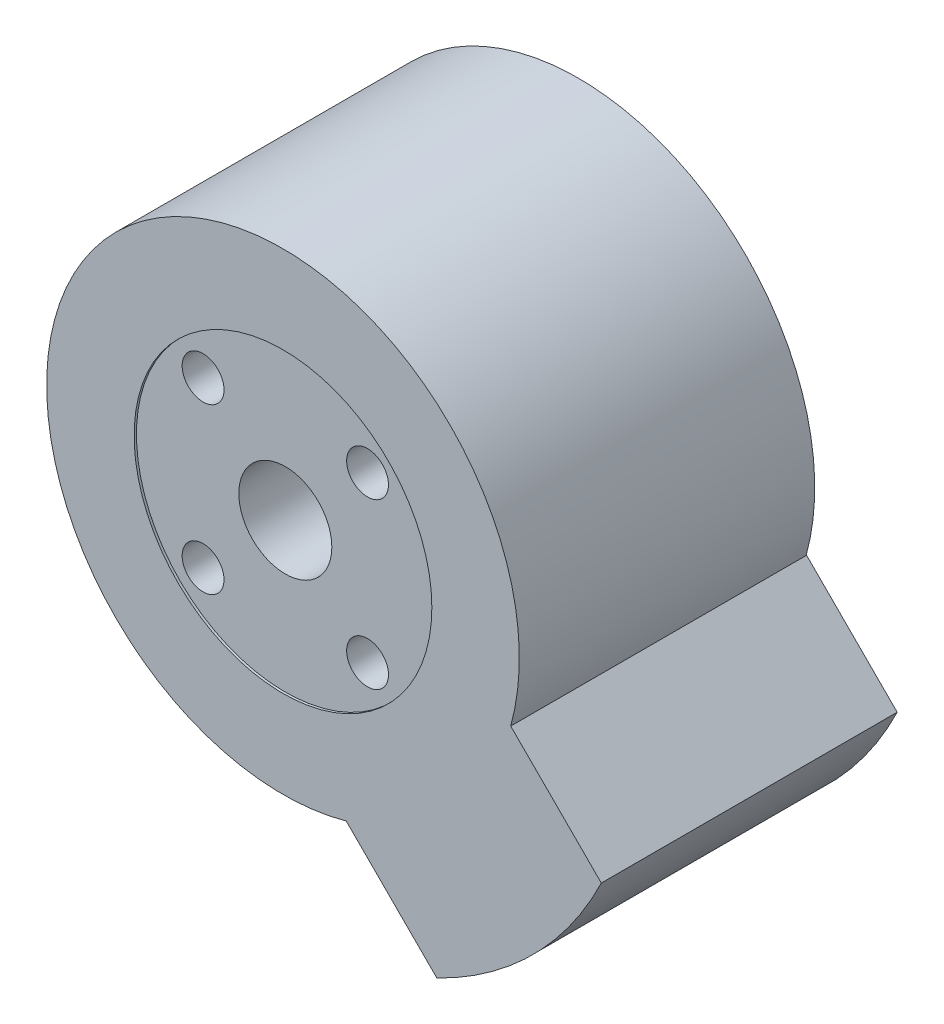
ISO-10303-21;
HEADER;
FILE_DESCRIPTION(('STEP AP214'),'2;1');
FILE_NAME('part.step','',(''),(''),'','','');
FILE_SCHEMA(('AUTOMOTIVE_DESIGN { 1 0 10303 214 1 1 1 1 }'));
ENDSEC;
DATA;
#1=APPLICATION_CONTEXT('core data for automotive mechanical design processes');
#2=APPLICATION_PROTOCOL_DEFINITION('international standard','automotive_design',2000,#1);
#3=PRODUCT_CONTEXT('',#1,'mechanical');
#4=PRODUCT('Part','Part','',(#3));
#5=PRODUCT_RELATED_PRODUCT_CATEGORY('part','',(#4));
#6=PRODUCT_DEFINITION_FORMATION('','',#4);
#7=PRODUCT_DEFINITION_CONTEXT('part definition',#1,'design');
#8=PRODUCT_DEFINITION('design','',#6,#7);
#9=PRODUCT_DEFINITION_SHAPE('','',#8);
#10=(LENGTH_UNIT() NAMED_UNIT(*) SI_UNIT(.MILLI.,.METRE.));
#11=(NAMED_UNIT(*) PLANE_ANGLE_UNIT() SI_UNIT($,.RADIAN.));
#12=(NAMED_UNIT(*) SI_UNIT($,.STERADIAN.) SOLID_ANGLE_UNIT());
#13=UNCERTAINTY_MEASURE_WITH_UNIT(LENGTH_MEASURE(1.E-05),#10,'distance_accuracy_value','');
#14=(GEOMETRIC_REPRESENTATION_CONTEXT(3) GLOBAL_UNCERTAINTY_ASSIGNED_CONTEXT((#13)) GLOBAL_UNIT_ASSIGNED_CONTEXT((#10,
#11,#12)) REPRESENTATION_CONTEXT('',''));
#15=CARTESIAN_POINT('',(0.,0.,0.));
#16=DIRECTION('',(0.,0.,1.));
#17=DIRECTION('',(1.,0.,0.));
#18=AXIS2_PLACEMENT_3D('',#15,#16,#17);
#19=CARTESIAN_POINT('',(0.,0.,-31.75));
#20=DIRECTION('',(0.,0.,1.));
#21=DIRECTION('',(1.,0.,0.));
#22=AXIS2_PLACEMENT_3D('',#19,#20,#21);
#23=CYLINDRICAL_SURFACE('',#22,25.4);
#24=DIRECTION('',(0.,0.,1.));
#25=VECTOR('',#24,1.);
#26=CARTESIAN_POINT('',(24.4738915284,-6.79622199873641,-31.8));
#27=LINE('',#26,#25);
#28=CARTESIAN_POINT('',(24.4738915284,-6.79622199873641,-31.75));
#29=VERTEX_POINT('',#28);
#30=CARTESIAN_POINT('',(24.4738915284,-6.79622199873641,0.));
#31=VERTEX_POINT('',#30);
#32=EDGE_CURVE('E114',#29,#31,#27,.T.);
#33=ORIENTED_EDGE('',*,*,#32,.F.);
#34=CARTESIAN_POINT('',(0.,0.,-31.75));
#35=DIRECTION('',(0.,0.,1.));
#36=DIRECTION('',(1.,0.,0.));
#37=AXIS2_PLACEMENT_3D('',#34,#35,#36);
#38=CIRCLE('',#37,25.4);
#39=CARTESIAN_POINT('',(6.79622199873634,-24.4738915284001,-31.75));
#40=VERTEX_POINT('',#39);
#41=EDGE_CURVE('E40',#29,#40,#38,.T.);
#42=ORIENTED_EDGE('',*,*,#41,.T.);
#43=DIRECTION('',(0.,0.,1.));
#44=VECTOR('',#43,1.);
#45=CARTESIAN_POINT('',(6.79622199873634,-24.4738915284001,-31.8));
#46=LINE('',#45,#44);
#47=CARTESIAN_POINT('',(6.79622199873634,-24.4738915284001,0.));
#48=VERTEX_POINT('',#47);
#49=EDGE_CURVE('E84',#40,#48,#46,.T.);
#50=ORIENTED_EDGE('',*,*,#49,.T.);
#51=CARTESIAN_POINT('',(0.,0.,0.));
#52=DIRECTION('',(0.,0.,1.));
#53=DIRECTION('',(1.,0.,0.));
#54=AXIS2_PLACEMENT_3D('',#51,#52,#53);
#55=CIRCLE('',#54,25.4);
#56=EDGE_CURVE('E35',#31,#48,#55,.T.);
#57=ORIENTED_EDGE('',*,*,#56,.F.);
#58=EDGE_LOOP('',(#33,#42,#50,#57));
#59=FACE_BOUND('',#58,.T.);
#60=ADVANCED_FACE('F32',(#59),#23,.T.);
#61=CARTESIAN_POINT('',(0.,0.,-31.75));
#62=DIRECTION('',(0.,0.,1.));
#63=DIRECTION('',(1.,0.,0.));
#64=AXIS2_PLACEMENT_3D('',#61,#62,#63);
#65=PLANE('',#64);
#66=CARTESIAN_POINT('',(0.,0.,-31.75));
#67=DIRECTION('',(0.,0.,1.));
#68=DIRECTION('',(1.,0.,0.));
#69=AXIS2_PLACEMENT_3D('',#66,#67,#68);
#70=CIRCLE('',#69,5.);
#71=CARTESIAN_POINT('',(5.,0.,-31.75));
#72=VERTEX_POINT('',#71);
#73=EDGE_CURVE('E118',#72,#72,#70,.T.);
#74=ORIENTED_EDGE('',*,*,#73,.T.);
#75=EDGE_LOOP('',(#74));
#76=FACE_BOUND('',#75,.T.);
#77=CARTESIAN_POINT('',(-8.83883476483185,8.83883476483185,-31.75));
#78=DIRECTION('',(0.,0.,1.));
#79=DIRECTION('',(1.,0.,0.));
#80=AXIS2_PLACEMENT_3D('',#77,#78,#79);
#81=CIRCLE('',#80,2.25);
#82=CARTESIAN_POINT('',(-6.58883476483185,8.83883476483185,-31.75));
#83=VERTEX_POINT('',#82);
#84=EDGE_CURVE('E126',#83,#83,#81,.T.);
#85=ORIENTED_EDGE('',*,*,#84,.T.);
#86=EDGE_LOOP('',(#85));
#87=FACE_BOUND('',#86,.T.);
#88=CARTESIAN_POINT('',(8.83883476483184,8.83883476483185,-31.75));
#89=DIRECTION('',(0.,0.,1.));
#90=DIRECTION('',(1.,0.,0.));
#91=AXIS2_PLACEMENT_3D('',#88,#89,#90);
#92=CIRCLE('',#91,2.25);
#93=CARTESIAN_POINT('',(11.0888347648318,8.83883476483185,-31.75));
#94=VERTEX_POINT('',#93);
#95=EDGE_CURVE('E132',#94,#94,#92,.T.);
#96=ORIENTED_EDGE('',*,*,#95,.T.);
#97=EDGE_LOOP('',(#96));
#98=FACE_BOUND('',#97,.T.);
#99=CARTESIAN_POINT('',(-8.83883476483185,-8.83883476483185,-31.75));
#100=DIRECTION('',(0.,0.,1.));
#101=DIRECTION('',(1.,0.,0.));
#102=AXIS2_PLACEMENT_3D('',#99,#100,#101);
#103=CIRCLE('',#102,2.25);
#104=CARTESIAN_POINT('',(-6.58883476483185,-8.83883476483185,-31.75));
#105=VERTEX_POINT('',#104);
#106=EDGE_CURVE('E138',#105,#105,#103,.T.);
#107=ORIENTED_EDGE('',*,*,#106,.T.);
#108=EDGE_LOOP('',(#107));
#109=FACE_BOUND('',#108,.T.);
#110=CARTESIAN_POINT('',(8.83883476483184,-8.83883476483185,-31.75));
#111=DIRECTION('',(0.,0.,1.));
#112=DIRECTION('',(1.,0.,0.));
#113=AXIS2_PLACEMENT_3D('',#110,#111,#112);
#114=CIRCLE('',#113,2.25);
#115=CARTESIAN_POINT('',(11.0888347648318,-8.83883476483185,-31.75));
#116=VERTEX_POINT('',#115);
#117=EDGE_CURVE('E144',#116,#116,#114,.T.);
#118=ORIENTED_EDGE('',*,*,#117,.T.);
#119=EDGE_LOOP('',(#118));
#120=FACE_BOUND('',#119,.T.);
#121=EDGE_CURVE('E11',#40,#29,#38,.T.);
#122=ORIENTED_EDGE('',*,*,#121,.F.);
#123=ORIENTED_EDGE('',*,*,#41,.F.);
#124=EDGE_LOOP('',(#122,#123));
#125=FACE_BOUND('',#124,.T.);
#126=ADVANCED_FACE('F158',(#76,#87,#98,#109,#120,#125),#65,.F.);
#127=CARTESIAN_POINT('',(0.,0.,0.));
#128=DIRECTION('',(0.,0.,1.));
#129=DIRECTION('',(1.,0.,0.));
#130=AXIS2_PLACEMENT_3D('',#127,#128,#129);
#131=PLANE('',#130);
#132=CARTESIAN_POINT('',(0.,0.,0.));
#133=DIRECTION('',(0.,0.,1.));
#134=DIRECTION('',(1.,0.,0.));
#135=AXIS2_PLACEMENT_3D('',#132,#133,#134);
#136=CIRCLE('',#135,16.);
#137=CARTESIAN_POINT('',(16.,0.,0.));
#138=VERTEX_POINT('',#137);
#139=EDGE_CURVE('E147',#138,#138,#136,.T.);
#140=ORIENTED_EDGE('',*,*,#139,.F.);
#141=EDGE_LOOP('',(#140));
#142=FACE_BOUND('',#141,.T.);
#143=ORIENTED_EDGE('',*,*,#56,.T.);
#144=DIRECTION('',(0.707106781186546,-0.707106781186549,0.));
#145=VECTOR('',#144,1.);
#146=CARTESIAN_POINT('',(6.79622199873634,-24.4738915284001,0.));
#147=LINE('',#146,#145);
#148=CARTESIAN_POINT('',(16.5358573515269,-34.2135268811906,0.));
#149=VERTEX_POINT('',#148);
#150=EDGE_CURVE('E108',#48,#149,#147,.T.);
#151=ORIENTED_EDGE('',*,*,#150,.T.);
#152=CARTESIAN_POINT('',(0.,0.,0.));
#153=DIRECTION('',(0.,0.,1.));
#154=DIRECTION('',(1.,0.,0.));
#155=AXIS2_PLACEMENT_3D('',#152,#153,#154);
#156=CIRCLE('',#155,38.);
#157=CARTESIAN_POINT('',(34.2135268811906,-16.535857351527,0.));
#158=VERTEX_POINT('',#157);
#159=EDGE_CURVE('E102',#149,#158,#156,.T.);
#160=ORIENTED_EDGE('',*,*,#159,.T.);
#161=DIRECTION('',(-0.707106781186547,0.707106781186548,0.));
#162=VECTOR('',#161,1.);
#163=CARTESIAN_POINT('',(24.4738915284,-6.79622199873641,0.));
#164=LINE('',#163,#162);
#165=EDGE_CURVE('E47',#158,#31,#164,.T.);
#166=ORIENTED_EDGE('',*,*,#165,.T.);
#167=EDGE_LOOP('',(#143,#151,#160,#166));
#168=FACE_BOUND('',#167,.T.);
#169=ADVANCED_FACE('F156',(#142,#168),#131,.T.);
#170=CARTESIAN_POINT('',(0.,0.,-0.25));
#171=DIRECTION('',(0.,0.,1.));
#172=DIRECTION('',(1.,0.,0.));
#173=AXIS2_PLACEMENT_3D('',#170,#171,#172);
#174=CYLINDRICAL_SURFACE('',#173,16.);
#175=CARTESIAN_POINT('',(0.,0.,-0.25));
#176=DIRECTION('',(0.,0.,1.));
#177=DIRECTION('',(1.,0.,0.));
#178=AXIS2_PLACEMENT_3D('',#175,#176,#177);
#179=CIRCLE('',#178,16.);
#180=CARTESIAN_POINT('',(16.,0.,-0.25));
#181=VERTEX_POINT('',#180);
#182=EDGE_CURVE('E148',#181,#181,#179,.T.);
#183=ORIENTED_EDGE('',*,*,#182,.F.);
#184=EDGE_LOOP('',(#183));
#185=FACE_BOUND('',#184,.T.);
#186=ORIENTED_EDGE('',*,*,#139,.T.);
#187=EDGE_LOOP('',(#186));
#188=FACE_BOUND('',#187,.T.);
#189=ADVANCED_FACE('F154',(#185,#188),#174,.F.);
#190=CARTESIAN_POINT('',(0.,0.,-0.25));
#191=DIRECTION('',(0.,0.,1.));
#192=DIRECTION('',(1.,0.,0.));
#193=AXIS2_PLACEMENT_3D('',#190,#191,#192);
#194=PLANE('',#193);
#195=CARTESIAN_POINT('',(0.,0.,-0.25));
#196=DIRECTION('',(0.,0.,1.));
#197=DIRECTION('',(1.,0.,0.));
#198=AXIS2_PLACEMENT_3D('',#195,#196,#197);
#199=CIRCLE('',#198,5.);
#200=CARTESIAN_POINT('',(5.,0.,-0.25));
#201=VERTEX_POINT('',#200);
#202=EDGE_CURVE('E113',#201,#201,#199,.T.);
#203=ORIENTED_EDGE('',*,*,#202,.F.);
#204=EDGE_LOOP('',(#203));
#205=FACE_BOUND('',#204,.T.);
#206=CARTESIAN_POINT('',(-8.83883476483185,8.83883476483185,-0.25));
#207=DIRECTION('',(0.,0.,1.));
#208=DIRECTION('',(1.,0.,0.));
#209=AXIS2_PLACEMENT_3D('',#206,#207,#208);
#210=CIRCLE('',#209,2.25);
#211=CARTESIAN_POINT('',(-6.58883476483185,8.83883476483185,-0.25));
#212=VERTEX_POINT('',#211);
#213=EDGE_CURVE('E121',#212,#212,#210,.T.);
#214=ORIENTED_EDGE('',*,*,#213,.F.);
#215=EDGE_LOOP('',(#214));
#216=FACE_BOUND('',#215,.T.);
#217=CARTESIAN_POINT('',(8.83883476483184,8.83883476483185,-0.25));
#218=DIRECTION('',(0.,0.,1.));
#219=DIRECTION('',(1.,0.,0.));
#220=AXIS2_PLACEMENT_3D('',#217,#218,#219);
#221=CIRCLE('',#220,2.25);
#222=CARTESIAN_POINT('',(11.0888347648318,8.83883476483185,-0.25));
#223=VERTEX_POINT('',#222);
#224=EDGE_CURVE('E129',#223,#223,#221,.T.);
#225=ORIENTED_EDGE('',*,*,#224,.F.);
#226=EDGE_LOOP('',(#225));
#227=FACE_BOUND('',#226,.T.);
#228=CARTESIAN_POINT('',(-8.83883476483185,-8.83883476483185,-0.25));
#229=DIRECTION('',(0.,0.,1.));
#230=DIRECTION('',(1.,0.,0.));
#231=AXIS2_PLACEMENT_3D('',#228,#229,#230);
#232=CIRCLE('',#231,2.25);
#233=CARTESIAN_POINT('',(-6.58883476483185,-8.83883476483185,-0.25));
#234=VERTEX_POINT('',#233);
#235=EDGE_CURVE('E135',#234,#234,#232,.T.);
#236=ORIENTED_EDGE('',*,*,#235,.F.);
#237=EDGE_LOOP('',(#236));
#238=FACE_BOUND('',#237,.T.);
#239=CARTESIAN_POINT('',(8.83883476483184,-8.83883476483185,-0.25));
#240=DIRECTION('',(0.,0.,1.));
#241=DIRECTION('',(1.,0.,0.));
#242=AXIS2_PLACEMENT_3D('',#239,#240,#241);
#243=CIRCLE('',#242,2.25);
#244=CARTESIAN_POINT('',(11.0888347648318,-8.83883476483185,-0.25));
#245=VERTEX_POINT('',#244);
#246=EDGE_CURVE('E141',#245,#245,#243,.T.);
#247=ORIENTED_EDGE('',*,*,#246,.F.);
#248=EDGE_LOOP('',(#247));
#249=FACE_BOUND('',#248,.T.);
#250=ORIENTED_EDGE('',*,*,#182,.T.);
#251=EDGE_LOOP('',(#250));
#252=FACE_BOUND('',#251,.T.);
#253=ADVANCED_FACE('F174',(#205,#216,#227,#238,#249,#252),#194,.T.);
#254=CARTESIAN_POINT('',(8.83883476483184,-8.83883476483185,-0.25));
#255=DIRECTION('',(0.,0.,1.));
#256=DIRECTION('',(1.,0.,0.));
#257=AXIS2_PLACEMENT_3D('',#254,#255,#256);
#258=CYLINDRICAL_SURFACE('',#257,2.25);
#259=ORIENTED_EDGE('',*,*,#117,.F.);
#260=EDGE_LOOP('',(#259));
#261=FACE_BOUND('',#260,.T.);
#262=ORIENTED_EDGE('',*,*,#246,.T.);
#263=EDGE_LOOP('',(#262));
#264=FACE_BOUND('',#263,.T.);
#265=ADVANCED_FACE('F178',(#261,#264),#258,.F.);
#266=CARTESIAN_POINT('',(-8.83883476483185,-8.83883476483185,-0.25));
#267=DIRECTION('',(0.,0.,1.));
#268=DIRECTION('',(1.,0.,0.));
#269=AXIS2_PLACEMENT_3D('',#266,#267,#268);
#270=CYLINDRICAL_SURFACE('',#269,2.25);
#271=ORIENTED_EDGE('',*,*,#106,.F.);
#272=EDGE_LOOP('',(#271));
#273=FACE_BOUND('',#272,.T.);
#274=ORIENTED_EDGE('',*,*,#235,.T.);
#275=EDGE_LOOP('',(#274));
#276=FACE_BOUND('',#275,.T.);
#277=ADVANCED_FACE('F182',(#273,#276),#270,.F.);
#278=CARTESIAN_POINT('',(8.83883476483184,8.83883476483185,-0.25));
#279=DIRECTION('',(0.,0.,1.));
#280=DIRECTION('',(1.,0.,0.));
#281=AXIS2_PLACEMENT_3D('',#278,#279,#280);
#282=CYLINDRICAL_SURFACE('',#281,2.25);
#283=ORIENTED_EDGE('',*,*,#95,.F.);
#284=EDGE_LOOP('',(#283));
#285=FACE_BOUND('',#284,.T.);
#286=ORIENTED_EDGE('',*,*,#224,.T.);
#287=EDGE_LOOP('',(#286));
#288=FACE_BOUND('',#287,.T.);
#289=ADVANCED_FACE('F186',(#285,#288),#282,.F.);
#290=CARTESIAN_POINT('',(-8.83883476483185,8.83883476483185,-0.25));
#291=DIRECTION('',(0.,0.,1.));
#292=DIRECTION('',(1.,0.,0.));
#293=AXIS2_PLACEMENT_3D('',#290,#291,#292);
#294=CYLINDRICAL_SURFACE('',#293,2.25);
#295=ORIENTED_EDGE('',*,*,#84,.F.);
#296=EDGE_LOOP('',(#295));
#297=FACE_BOUND('',#296,.T.);
#298=ORIENTED_EDGE('',*,*,#213,.T.);
#299=EDGE_LOOP('',(#298));
#300=FACE_BOUND('',#299,.T.);
#301=ADVANCED_FACE('F190',(#297,#300),#294,.F.);
#302=CARTESIAN_POINT('',(0.,0.,-31.75));
#303=DIRECTION('',(0.,0.,1.));
#304=DIRECTION('',(1.,0.,0.));
#305=AXIS2_PLACEMENT_3D('',#302,#303,#304);
#306=CYLINDRICAL_SURFACE('',#305,5.);
#307=ORIENTED_EDGE('',*,*,#73,.F.);
#308=EDGE_LOOP('',(#307));
#309=FACE_BOUND('',#308,.T.);
#310=ORIENTED_EDGE('',*,*,#202,.T.);
#311=EDGE_LOOP('',(#310));
#312=FACE_BOUND('',#311,.T.);
#313=ADVANCED_FACE('F194',(#309,#312),#306,.F.);
#314=CARTESIAN_POINT('',(0.,0.,-31.8));
#315=DIRECTION('',(0.,0.,1.));
#316=DIRECTION('',(1.,0.,0.));
#317=AXIS2_PLACEMENT_3D('',#314,#315,#316);
#318=CYLINDRICAL_SURFACE('',#317,25.4);
#319=ORIENTED_EDGE('',*,*,#121,.T.);
#320=CARTESIAN_POINT('',(24.4738915284,-6.79622199873641,-31.8));
#321=VERTEX_POINT('',#320);
#322=EDGE_CURVE('E100',#321,#29,#27,.T.);
#323=ORIENTED_EDGE('',*,*,#322,.F.);
#324=CARTESIAN_POINT('',(0.,0.,-31.8));
#325=DIRECTION('',(0.,0.,-1.));
#326=DIRECTION('',(1.,0.,0.));
#327=AXIS2_PLACEMENT_3D('',#324,#325,#326);
#328=CIRCLE('',#327,25.4);
#329=CARTESIAN_POINT('',(6.79622199873634,-24.4738915284001,-31.8));
#330=VERTEX_POINT('',#329);
#331=EDGE_CURVE('E94',#321,#330,#328,.T.);
#332=ORIENTED_EDGE('',*,*,#331,.T.);
#333=EDGE_CURVE('E79',#330,#40,#46,.T.);
#334=ORIENTED_EDGE('',*,*,#333,.T.);
#335=EDGE_LOOP('',(#319,#323,#332,#334));
#336=FACE_BOUND('',#335,.T.);
#337=ADVANCED_FACE('F99',(#336),#318,.F.);
#338=CARTESIAN_POINT('',(24.4738915284,-6.79622199873641,-31.8));
#339=DIRECTION('',(0.707106781186548,0.707106781186547,0.));
#340=DIRECTION('',(-0.707106781186547,0.707106781186548,0.));
#341=AXIS2_PLACEMENT_3D('',#338,#339,#340);
#342=PLANE('',#341);
#343=ORIENTED_EDGE('',*,*,#165,.F.);
#344=DIRECTION('',(0.,0.,1.));
#345=VECTOR('',#344,1.);
#346=CARTESIAN_POINT('',(34.2135268811906,-16.535857351527,-31.8));
#347=LINE('',#346,#345);
#348=CARTESIAN_POINT('',(34.2135268811906,-16.535857351527,-31.8));
#349=VERTEX_POINT('',#348);
#350=EDGE_CURVE('E115',#349,#158,#347,.T.);
#351=ORIENTED_EDGE('',*,*,#350,.F.);
#352=DIRECTION('',(-0.707106781186547,0.707106781186548,0.));
#353=VECTOR('',#352,1.);
#354=CARTESIAN_POINT('',(24.4738915284,-6.79622199873641,-31.8));
#355=LINE('',#354,#353);
#356=EDGE_CURVE('E106',#349,#321,#355,.T.);
#357=ORIENTED_EDGE('',*,*,#356,.T.);
#358=ORIENTED_EDGE('',*,*,#322,.T.);
#359=ORIENTED_EDGE('',*,*,#32,.T.);
#360=EDGE_LOOP('',(#343,#351,#357,#358,#359));
#361=FACE_BOUND('',#360,.T.);
#362=ADVANCED_FACE('F201',(#361),#342,.T.);
#363=CARTESIAN_POINT('',(0.,0.,-31.8));
#364=DIRECTION('',(0.,0.,1.));
#365=DIRECTION('',(1.,0.,0.));
#366=AXIS2_PLACEMENT_3D('',#363,#364,#365);
#367=CYLINDRICAL_SURFACE('',#366,38.);
#368=ORIENTED_EDGE('',*,*,#159,.F.);
#369=DIRECTION('',(0.,0.,1.));
#370=VECTOR('',#369,1.);
#371=CARTESIAN_POINT('',(16.5358573515269,-34.2135268811906,-31.8));
#372=LINE('',#371,#370);
#373=CARTESIAN_POINT('',(16.5358573515269,-34.2135268811906,-31.8));
#374=VERTEX_POINT('',#373);
#375=EDGE_CURVE('E87',#374,#149,#372,.T.);
#376=ORIENTED_EDGE('',*,*,#375,.F.);
#377=CARTESIAN_POINT('',(0.,0.,-31.8));
#378=DIRECTION('',(0.,0.,1.));
#379=DIRECTION('',(1.,0.,0.));
#380=AXIS2_PLACEMENT_3D('',#377,#378,#379);
#381=CIRCLE('',#380,38.);
#382=EDGE_CURVE('E97',#374,#349,#381,.T.);
#383=ORIENTED_EDGE('',*,*,#382,.T.);
#384=ORIENTED_EDGE('',*,*,#350,.T.);
#385=EDGE_LOOP('',(#368,#376,#383,#384));
#386=FACE_BOUND('',#385,.T.);
#387=ADVANCED_FACE('F204',(#386),#367,.T.);
#388=CARTESIAN_POINT('',(6.79622199873634,-24.4738915284001,-31.8));
#389=DIRECTION('',(-0.707106781186549,-0.707106781186546,0.));
#390=DIRECTION('',(0.707106781186546,-0.707106781186549,0.));
#391=AXIS2_PLACEMENT_3D('',#388,#389,#390);
#392=PLANE('',#391);
#393=ORIENTED_EDGE('',*,*,#150,.F.);
#394=ORIENTED_EDGE('',*,*,#49,.F.);
#395=ORIENTED_EDGE('',*,*,#333,.F.);
#396=DIRECTION('',(0.707106781186546,-0.707106781186549,0.));
#397=VECTOR('',#396,1.);
#398=CARTESIAN_POINT('',(6.79622199873634,-24.4738915284001,-31.8));
#399=LINE('',#398,#397);
#400=EDGE_CURVE('E82',#330,#374,#399,.T.);
#401=ORIENTED_EDGE('',*,*,#400,.T.);
#402=ORIENTED_EDGE('',*,*,#375,.T.);
#403=EDGE_LOOP('',(#393,#394,#395,#401,#402));
#404=FACE_BOUND('',#403,.T.);
#405=ADVANCED_FACE('F81',(#404),#392,.T.);
#406=CARTESIAN_POINT('',(0.,0.,-31.8));
#407=DIRECTION('',(0.,0.,1.));
#408=DIRECTION('',(1.,0.,0.));
#409=AXIS2_PLACEMENT_3D('',#406,#407,#408);
#410=PLANE('',#409);
#411=ORIENTED_EDGE('',*,*,#331,.F.);
#412=ORIENTED_EDGE('',*,*,#356,.F.);
#413=ORIENTED_EDGE('',*,*,#382,.F.);
#414=ORIENTED_EDGE('',*,*,#400,.F.);
#415=EDGE_LOOP('',(#411,#412,#413,#414));
#416=FACE_BOUND('',#415,.T.);
#417=ADVANCED_FACE('F92',(#416),#410,.F.);
#418=CLOSED_SHELL('',(#60,#126,#169,#189,#253,#265,#277,#289,#301,#313,#337,#362,#387,#405,#417));
#419=MANIFOLD_SOLID_BREP('B2',#418);
#420=ADVANCED_BREP_SHAPE_REPRESENTATION('',(#18,#419),#14);
#421=SHAPE_DEFINITION_REPRESENTATION(#9,#420);
ENDSEC;
END-ISO-10303-21;
